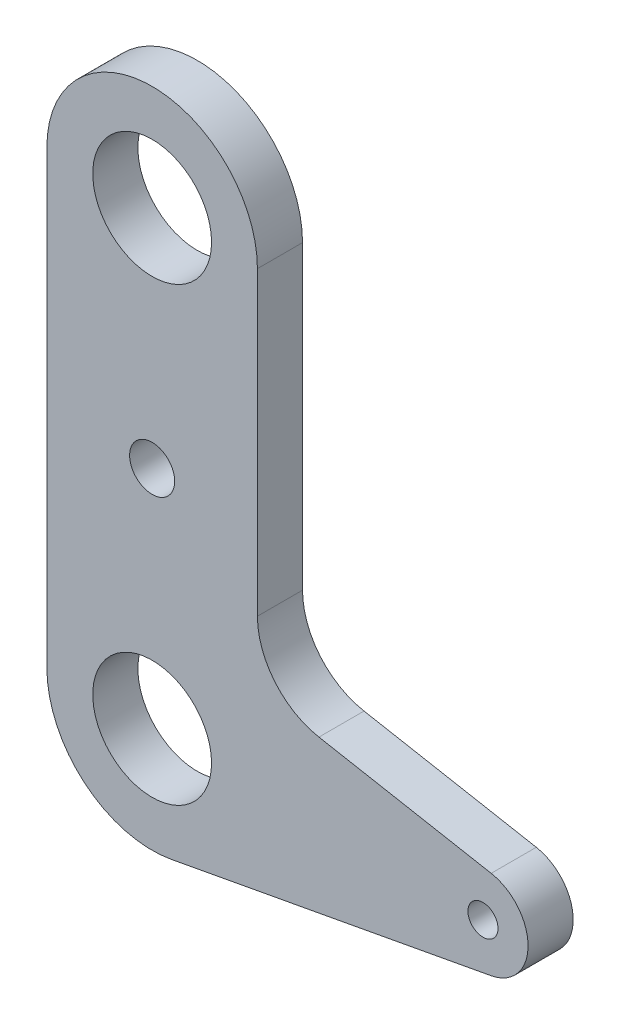
ISO-10303-21;
HEADER;
FILE_DESCRIPTION(('STEP AP214'),'2;1');
FILE_NAME('part.step','',(''),(''),'','','');
FILE_SCHEMA(('AUTOMOTIVE_DESIGN { 1 0 10303 214 1 1 1 1 }'));
ENDSEC;
DATA;
#1=APPLICATION_CONTEXT('core data for automotive mechanical design processes');
#2=APPLICATION_PROTOCOL_DEFINITION('international standard','automotive_design',2000,#1);
#3=PRODUCT_CONTEXT('',#1,'mechanical');
#4=PRODUCT('Part','Part','',(#3));
#5=PRODUCT_RELATED_PRODUCT_CATEGORY('part','',(#4));
#6=PRODUCT_DEFINITION_FORMATION('','',#4);
#7=PRODUCT_DEFINITION_CONTEXT('part definition',#1,'design');
#8=PRODUCT_DEFINITION('design','',#6,#7);
#9=PRODUCT_DEFINITION_SHAPE('','',#8);
#10=(LENGTH_UNIT() NAMED_UNIT(*) SI_UNIT(.MILLI.,.METRE.));
#11=(NAMED_UNIT(*) PLANE_ANGLE_UNIT() SI_UNIT($,.RADIAN.));
#12=(NAMED_UNIT(*) SI_UNIT($,.STERADIAN.) SOLID_ANGLE_UNIT());
#13=UNCERTAINTY_MEASURE_WITH_UNIT(LENGTH_MEASURE(1.E-05),#10,'distance_accuracy_value','');
#14=(GEOMETRIC_REPRESENTATION_CONTEXT(3) GLOBAL_UNCERTAINTY_ASSIGNED_CONTEXT((#13)) GLOBAL_UNIT_ASSIGNED_CONTEXT((#10,
#11,#12)) REPRESENTATION_CONTEXT('',''));
#15=CARTESIAN_POINT('',(0.,0.,0.));
#16=DIRECTION('',(0.,0.,1.));
#17=DIRECTION('',(1.,0.,0.));
#18=AXIS2_PLACEMENT_3D('',#15,#16,#17);
#19=CARTESIAN_POINT('',(-7.,0.,3.));
#20=DIRECTION('',(1.,0.,0.));
#21=DIRECTION('',(0.,1.,0.));
#22=AXIS2_PLACEMENT_3D('',#19,#20,#21);
#23=PLANE('',#22);
#24=DIRECTION('',(0.,-1.,0.));
#25=VECTOR('',#24,1.);
#26=CARTESIAN_POINT('',(-7.,0.,0.));
#27=LINE('',#26,#25);
#28=CARTESIAN_POINT('',(-7.,30.,0.));
#29=VERTEX_POINT('',#28);
#30=CARTESIAN_POINT('',(-7.,0.,0.));
#31=VERTEX_POINT('',#30);
#32=EDGE_CURVE('E129',#29,#31,#27,.T.);
#33=ORIENTED_EDGE('',*,*,#32,.T.);
#34=DIRECTION('',(0.,0.,-1.));
#35=VECTOR('',#34,1.);
#36=CARTESIAN_POINT('',(-7.,0.,3.));
#37=LINE('',#36,#35);
#38=CARTESIAN_POINT('',(-7.,0.,3.));
#39=VERTEX_POINT('',#38);
#40=EDGE_CURVE('E108',#39,#31,#37,.T.);
#41=ORIENTED_EDGE('',*,*,#40,.F.);
#42=DIRECTION('',(0.,-1.,0.));
#43=VECTOR('',#42,1.);
#44=CARTESIAN_POINT('',(-7.,0.,3.));
#45=LINE('',#44,#43);
#46=CARTESIAN_POINT('',(-7.,30.,3.));
#47=VERTEX_POINT('',#46);
#48=EDGE_CURVE('E115',#47,#39,#45,.T.);
#49=ORIENTED_EDGE('',*,*,#48,.F.);
#50=DIRECTION('',(0.,0.,-1.));
#51=VECTOR('',#50,1.);
#52=CARTESIAN_POINT('',(-7.,30.,3.));
#53=LINE('',#52,#51);
#54=EDGE_CURVE('E145',#47,#29,#53,.T.);
#55=ORIENTED_EDGE('',*,*,#54,.T.);
#56=EDGE_LOOP('',(#33,#41,#49,#55));
#57=FACE_BOUND('',#56,.T.);
#58=ADVANCED_FACE('F41',(#57),#23,.F.);
#59=CARTESIAN_POINT('',(0.,0.,3.));
#60=DIRECTION('',(0.,0.,-1.));
#61=DIRECTION('',(-1.,0.,0.));
#62=AXIS2_PLACEMENT_3D('',#59,#60,#61);
#63=CYLINDRICAL_SURFACE('',#62,7.);
#64=CARTESIAN_POINT('',(0.,0.,0.));
#65=DIRECTION('',(0.,0.,1.));
#66=DIRECTION('',(1.,0.,0.));
#67=AXIS2_PLACEMENT_3D('',#64,#65,#66);
#68=CIRCLE('',#67,7.);
#69=CARTESIAN_POINT('',(1.27272727272727,-6.88332516224943,0.));
#70=VERTEX_POINT('',#69);
#71=EDGE_CURVE('E168',#31,#70,#68,.T.);
#72=ORIENTED_EDGE('',*,*,#71,.T.);
#73=DIRECTION('',(0.,0.,-1.));
#74=VECTOR('',#73,1.);
#75=CARTESIAN_POINT('',(1.27272727272727,-6.88332516224943,3.));
#76=LINE('',#75,#74);
#77=CARTESIAN_POINT('',(1.27272727272727,-6.88332516224943,3.));
#78=VERTEX_POINT('',#77);
#79=EDGE_CURVE('E111',#78,#70,#76,.T.);
#80=ORIENTED_EDGE('',*,*,#79,.F.);
#81=CARTESIAN_POINT('',(0.,0.,3.));
#82=DIRECTION('',(0.,0.,1.));
#83=DIRECTION('',(1.,0.,0.));
#84=AXIS2_PLACEMENT_3D('',#81,#82,#83);
#85=CIRCLE('',#84,7.);
#86=EDGE_CURVE('E104',#39,#78,#85,.T.);
#87=ORIENTED_EDGE('',*,*,#86,.F.);
#88=ORIENTED_EDGE('',*,*,#40,.T.);
#89=EDGE_LOOP('',(#72,#80,#87,#88));
#90=FACE_BOUND('',#89,.T.);
#91=ADVANCED_FACE('F106',(#90),#63,.T.);
#92=CARTESIAN_POINT('',(1.27272727272727,-6.88332516224943,3.));
#93=DIRECTION('',(-0.181818181818182,0.983332166035633,0.));
#94=DIRECTION('',(-0.983332166035634,-0.181818181818182,0.));
#95=AXIS2_PLACEMENT_3D('',#92,#93,#94);
#96=PLANE('',#95);
#97=DIRECTION('',(0.983332166035634,0.181818181818182,0.));
#98=VECTOR('',#97,1.);
#99=CARTESIAN_POINT('',(1.27272727272727,-6.88332516224943,0.));
#100=LINE('',#99,#98);
#101=CARTESIAN_POINT('',(22.5454545454545,-2.9499964981069,0.));
#102=VERTEX_POINT('',#101);
#103=EDGE_CURVE('E166',#70,#102,#100,.T.);
#104=ORIENTED_EDGE('',*,*,#103,.T.);
#105=DIRECTION('',(0.,0.,-1.));
#106=VECTOR('',#105,1.);
#107=CARTESIAN_POINT('',(22.5454545454545,-2.9499964981069,3.));
#108=LINE('',#107,#106);
#109=CARTESIAN_POINT('',(22.5454545454545,-2.9499964981069,3.));
#110=VERTEX_POINT('',#109);
#111=EDGE_CURVE('E134',#110,#102,#108,.T.);
#112=ORIENTED_EDGE('',*,*,#111,.F.);
#113=DIRECTION('',(0.983332166035634,0.181818181818182,0.));
#114=VECTOR('',#113,1.);
#115=CARTESIAN_POINT('',(1.27272727272727,-6.88332516224943,3.));
#116=LINE('',#115,#114);
#117=EDGE_CURVE('E114',#78,#110,#116,.T.);
#118=ORIENTED_EDGE('',*,*,#117,.F.);
#119=ORIENTED_EDGE('',*,*,#79,.T.);
#120=EDGE_LOOP('',(#104,#112,#118,#119));
#121=FACE_BOUND('',#120,.T.);
#122=ADVANCED_FACE('F215',(#121),#96,.F.);
#123=CARTESIAN_POINT('',(22.,0.,3.));
#124=DIRECTION('',(0.,0.,-1.));
#125=DIRECTION('',(-1.,0.,0.));
#126=AXIS2_PLACEMENT_3D('',#123,#124,#125);
#127=CYLINDRICAL_SURFACE('',#126,3.);
#128=CARTESIAN_POINT('',(22.,0.,0.));
#129=DIRECTION('',(0.,0.,1.));
#130=DIRECTION('',(1.,0.,0.));
#131=AXIS2_PLACEMENT_3D('',#128,#129,#130);
#132=CIRCLE('',#131,3.);
#133=CARTESIAN_POINT('',(22.5454545454545,2.9499964981069,0.));
#134=VERTEX_POINT('',#133);
#135=EDGE_CURVE('E163',#102,#134,#132,.T.);
#136=ORIENTED_EDGE('',*,*,#135,.T.);
#137=DIRECTION('',(0.,0.,-1.));
#138=VECTOR('',#137,1.);
#139=CARTESIAN_POINT('',(22.5454545454545,2.9499964981069,3.));
#140=LINE('',#139,#138);
#141=CARTESIAN_POINT('',(22.5454545454545,2.9499964981069,3.));
#142=VERTEX_POINT('',#141);
#143=EDGE_CURVE('E140',#142,#134,#140,.T.);
#144=ORIENTED_EDGE('',*,*,#143,.F.);
#145=CARTESIAN_POINT('',(22.,0.,3.));
#146=DIRECTION('',(0.,0.,1.));
#147=DIRECTION('',(1.,0.,0.));
#148=AXIS2_PLACEMENT_3D('',#145,#146,#147);
#149=CIRCLE('',#148,3.);
#150=EDGE_CURVE('E188',#110,#142,#149,.T.);
#151=ORIENTED_EDGE('',*,*,#150,.F.);
#152=ORIENTED_EDGE('',*,*,#111,.T.);
#153=EDGE_LOOP('',(#136,#144,#151,#152));
#154=FACE_BOUND('',#153,.T.);
#155=ADVANCED_FACE('F241',(#154),#127,.T.);
#156=CARTESIAN_POINT('',(1.27272727272727,6.88332516224943,3.));
#157=DIRECTION('',(0.181818181818182,0.983332166035633,0.));
#158=DIRECTION('',(-0.983332166035634,0.181818181818182,0.));
#159=AXIS2_PLACEMENT_3D('',#156,#157,#158);
#160=PLANE('',#159);
#161=DIRECTION('',(0.983332166035634,-0.181818181818182,0.));
#162=VECTOR('',#161,1.);
#163=CARTESIAN_POINT('',(1.27272727272727,6.88332516224943,0.));
#164=LINE('',#163,#162);
#165=CARTESIAN_POINT('',(11.0909090909091,5.06794270187596,0.));
#166=VERTEX_POINT('',#165);
#167=EDGE_CURVE('E161',#166,#134,#164,.T.);
#168=ORIENTED_EDGE('',*,*,#167,.F.);
#169=DIRECTION('',(0.,0.,-1.));
#170=VECTOR('',#169,1.);
#171=CARTESIAN_POINT('',(11.0909090909091,5.06794270187596,3.));
#172=LINE('',#171,#170);
#173=CARTESIAN_POINT('',(11.0909090909091,5.06794270187596,3.));
#174=VERTEX_POINT('',#173);
#175=EDGE_CURVE('E56',#166,#174,#172,.F.);
#176=ORIENTED_EDGE('',*,*,#175,.T.);
#177=DIRECTION('',(0.983332166035634,-0.181818181818182,0.));
#178=VECTOR('',#177,1.);
#179=CARTESIAN_POINT('',(1.27272727272727,6.88332516224943,3.));
#180=LINE('',#179,#178);
#181=EDGE_CURVE('E186',#174,#142,#180,.T.);
#182=ORIENTED_EDGE('',*,*,#181,.T.);
#183=ORIENTED_EDGE('',*,*,#143,.T.);
#184=EDGE_LOOP('',(#168,#176,#182,#183));
#185=FACE_BOUND('',#184,.T.);
#186=ADVANCED_FACE('F237',(#185),#160,.T.);
#187=CARTESIAN_POINT('',(7.,0.,3.));
#188=DIRECTION('',(1.,0.,0.));
#189=DIRECTION('',(0.,1.,0.));
#190=AXIS2_PLACEMENT_3D('',#187,#188,#189);
#191=PLANE('',#190);
#192=DIRECTION('',(0.,-1.,0.));
#193=VECTOR('',#192,1.);
#194=CARTESIAN_POINT('',(7.,0.,3.));
#195=LINE('',#194,#193);
#196=CARTESIAN_POINT('',(7.,30.,3.));
#197=VERTEX_POINT('',#196);
#198=CARTESIAN_POINT('',(7.,9.98460353205412,3.));
#199=VERTEX_POINT('',#198);
#200=EDGE_CURVE('E183',#197,#199,#195,.T.);
#201=ORIENTED_EDGE('',*,*,#200,.T.);
#202=DIRECTION('',(0.,0.,-1.));
#203=VECTOR('',#202,1.);
#204=CARTESIAN_POINT('',(7.,9.98460353205412,0.));
#205=LINE('',#204,#203);
#206=CARTESIAN_POINT('',(7.,9.98460353205412,0.));
#207=VERTEX_POINT('',#206);
#208=EDGE_CURVE('E130',#199,#207,#205,.T.);
#209=ORIENTED_EDGE('',*,*,#208,.T.);
#210=DIRECTION('',(0.,-1.,0.));
#211=VECTOR('',#210,1.);
#212=CARTESIAN_POINT('',(7.,0.,0.));
#213=LINE('',#212,#211);
#214=CARTESIAN_POINT('',(7.,30.,0.));
#215=VERTEX_POINT('',#214);
#216=EDGE_CURVE('E159',#215,#207,#213,.T.);
#217=ORIENTED_EDGE('',*,*,#216,.F.);
#218=DIRECTION('',(0.,0.,-1.));
#219=VECTOR('',#218,1.);
#220=CARTESIAN_POINT('',(7.,30.,3.));
#221=LINE('',#220,#219);
#222=EDGE_CURVE('E143',#197,#215,#221,.T.);
#223=ORIENTED_EDGE('',*,*,#222,.F.);
#224=EDGE_LOOP('',(#201,#209,#217,#223));
#225=FACE_BOUND('',#224,.T.);
#226=ADVANCED_FACE('F234',(#225),#191,.T.);
#227=CARTESIAN_POINT('',(0.,0.,3.));
#228=DIRECTION('',(0.,0.,-1.));
#229=DIRECTION('',(-1.,0.,0.));
#230=AXIS2_PLACEMENT_3D('',#227,#228,#229);
#231=CYLINDRICAL_SURFACE('',#230,3.95);
#232=CARTESIAN_POINT('',(0.,0.,3.));
#233=DIRECTION('',(0.,0.,1.));
#234=DIRECTION('',(1.,0.,0.));
#235=AXIS2_PLACEMENT_3D('',#232,#233,#234);
#236=CIRCLE('',#235,3.95);
#237=CARTESIAN_POINT('',(3.95,0.,3.));
#238=VERTEX_POINT('',#237);
#239=EDGE_CURVE('E176',#238,#238,#236,.T.);
#240=ORIENTED_EDGE('',*,*,#239,.T.);
#241=EDGE_LOOP('',(#240));
#242=FACE_BOUND('',#241,.T.);
#243=CARTESIAN_POINT('',(0.,0.,0.));
#244=DIRECTION('',(0.,0.,1.));
#245=DIRECTION('',(1.,0.,0.));
#246=AXIS2_PLACEMENT_3D('',#243,#244,#245);
#247=CIRCLE('',#246,3.95);
#248=CARTESIAN_POINT('',(3.95,0.,0.));
#249=VERTEX_POINT('',#248);
#250=EDGE_CURVE('E151',#249,#249,#247,.T.);
#251=ORIENTED_EDGE('',*,*,#250,.F.);
#252=EDGE_LOOP('',(#251));
#253=FACE_BOUND('',#252,.T.);
#254=ADVANCED_FACE('F229',(#242,#253),#231,.F.);
#255=CARTESIAN_POINT('',(0.,30.,3.));
#256=DIRECTION('',(0.,0.,-1.));
#257=DIRECTION('',(-1.,0.,0.));
#258=AXIS2_PLACEMENT_3D('',#255,#256,#257);
#259=CYLINDRICAL_SURFACE('',#258,3.95);
#260=CARTESIAN_POINT('',(0.,30.,3.));
#261=DIRECTION('',(0.,0.,1.));
#262=DIRECTION('',(1.,0.,0.));
#263=AXIS2_PLACEMENT_3D('',#260,#261,#262);
#264=CIRCLE('',#263,3.95);
#265=CARTESIAN_POINT('',(3.95,30.,3.));
#266=VERTEX_POINT('',#265);
#267=EDGE_CURVE('E179',#266,#266,#264,.T.);
#268=ORIENTED_EDGE('',*,*,#267,.T.);
#269=EDGE_LOOP('',(#268));
#270=FACE_BOUND('',#269,.T.);
#271=CARTESIAN_POINT('',(0.,30.,0.));
#272=DIRECTION('',(0.,0.,1.));
#273=DIRECTION('',(1.,0.,0.));
#274=AXIS2_PLACEMENT_3D('',#271,#272,#273);
#275=CIRCLE('',#274,3.95);
#276=CARTESIAN_POINT('',(3.95,30.,0.));
#277=VERTEX_POINT('',#276);
#278=EDGE_CURVE('E154',#277,#277,#275,.T.);
#279=ORIENTED_EDGE('',*,*,#278,.F.);
#280=EDGE_LOOP('',(#279));
#281=FACE_BOUND('',#280,.T.);
#282=ADVANCED_FACE('F223',(#270,#281),#259,.F.);
#283=CARTESIAN_POINT('',(0.,30.,3.));
#284=DIRECTION('',(0.,0.,-1.));
#285=DIRECTION('',(-1.,0.,0.));
#286=AXIS2_PLACEMENT_3D('',#283,#284,#285);
#287=CYLINDRICAL_SURFACE('',#286,7.);
#288=CARTESIAN_POINT('',(0.,30.,0.));
#289=DIRECTION('',(0.,0.,1.));
#290=DIRECTION('',(1.,0.,0.));
#291=AXIS2_PLACEMENT_3D('',#288,#289,#290);
#292=CIRCLE('',#291,7.);
#293=EDGE_CURVE('E157',#215,#29,#292,.T.);
#294=ORIENTED_EDGE('',*,*,#293,.T.);
#295=ORIENTED_EDGE('',*,*,#54,.F.);
#296=CARTESIAN_POINT('',(0.,30.,3.));
#297=DIRECTION('',(0.,0.,1.));
#298=DIRECTION('',(1.,0.,0.));
#299=AXIS2_PLACEMENT_3D('',#296,#297,#298);
#300=CIRCLE('',#299,7.);
#301=EDGE_CURVE('E122',#197,#47,#300,.T.);
#302=ORIENTED_EDGE('',*,*,#301,.F.);
#303=ORIENTED_EDGE('',*,*,#222,.T.);
#304=EDGE_LOOP('',(#294,#295,#302,#303));
#305=FACE_BOUND('',#304,.T.);
#306=ADVANCED_FACE('F219',(#305),#287,.T.);
#307=CARTESIAN_POINT('',(0.,15.,3.));
#308=DIRECTION('',(0.,0.,-1.));
#309=DIRECTION('',(-1.,0.,0.));
#310=AXIS2_PLACEMENT_3D('',#307,#308,#309);
#311=CYLINDRICAL_SURFACE('',#310,1.5);
#312=CARTESIAN_POINT('',(0.,15.,3.));
#313=DIRECTION('',(0.,0.,1.));
#314=DIRECTION('',(1.,0.,0.));
#315=AXIS2_PLACEMENT_3D('',#312,#313,#314);
#316=CIRCLE('',#315,1.5);
#317=CARTESIAN_POINT('',(1.5,15.,3.));
#318=VERTEX_POINT('',#317);
#319=EDGE_CURVE('E126',#318,#318,#316,.T.);
#320=ORIENTED_EDGE('',*,*,#319,.T.);
#321=EDGE_LOOP('',(#320));
#322=FACE_BOUND('',#321,.T.);
#323=CARTESIAN_POINT('',(0.,15.,0.));
#324=DIRECTION('',(0.,0.,1.));
#325=DIRECTION('',(1.,0.,0.));
#326=AXIS2_PLACEMENT_3D('',#323,#324,#325);
#327=CIRCLE('',#326,1.5);
#328=CARTESIAN_POINT('',(1.5,15.,0.));
#329=VERTEX_POINT('',#328);
#330=EDGE_CURVE('E171',#329,#329,#327,.T.);
#331=ORIENTED_EDGE('',*,*,#330,.F.);
#332=EDGE_LOOP('',(#331));
#333=FACE_BOUND('',#332,.T.);
#334=ADVANCED_FACE('F195',(#322,#333),#311,.F.);
#335=CARTESIAN_POINT('',(22.,0.,3.));
#336=DIRECTION('',(0.,0.,-1.));
#337=DIRECTION('',(-1.,0.,0.));
#338=AXIS2_PLACEMENT_3D('',#335,#336,#337);
#339=CYLINDRICAL_SURFACE('',#338,1.);
#340=CARTESIAN_POINT('',(22.,0.,3.));
#341=DIRECTION('',(0.,0.,1.));
#342=DIRECTION('',(1.,0.,0.));
#343=AXIS2_PLACEMENT_3D('',#340,#341,#342);
#344=CIRCLE('',#343,1.);
#345=CARTESIAN_POINT('',(23.,0.,3.));
#346=VERTEX_POINT('',#345);
#347=EDGE_CURVE('E147',#346,#346,#344,.T.);
#348=ORIENTED_EDGE('',*,*,#347,.T.);
#349=EDGE_LOOP('',(#348));
#350=FACE_BOUND('',#349,.T.);
#351=CARTESIAN_POINT('',(22.,0.,0.));
#352=DIRECTION('',(0.,0.,1.));
#353=DIRECTION('',(1.,0.,0.));
#354=AXIS2_PLACEMENT_3D('',#351,#352,#353);
#355=CIRCLE('',#354,1.);
#356=CARTESIAN_POINT('',(23.,0.,0.));
#357=VERTEX_POINT('',#356);
#358=EDGE_CURVE('E148',#357,#357,#355,.T.);
#359=ORIENTED_EDGE('',*,*,#358,.F.);
#360=EDGE_LOOP('',(#359));
#361=FACE_BOUND('',#360,.T.);
#362=ADVANCED_FACE('F200',(#350,#361),#339,.F.);
#363=CARTESIAN_POINT('',(0.,0.,3.));
#364=DIRECTION('',(0.,0.,1.));
#365=DIRECTION('',(1.,0.,0.));
#366=AXIS2_PLACEMENT_3D('',#363,#364,#365);
#367=PLANE('',#366);
#368=ORIENTED_EDGE('',*,*,#319,.F.);
#369=EDGE_LOOP('',(#368));
#370=FACE_BOUND('',#369,.T.);
#371=ORIENTED_EDGE('',*,*,#48,.T.);
#372=ORIENTED_EDGE('',*,*,#86,.T.);
#373=ORIENTED_EDGE('',*,*,#117,.T.);
#374=ORIENTED_EDGE('',*,*,#150,.T.);
#375=ORIENTED_EDGE('',*,*,#181,.F.);
#376=CARTESIAN_POINT('',(12.,9.98460353205412,3.));
#377=DIRECTION('',(0.,0.,1.));
#378=DIRECTION('',(1.,0.,0.));
#379=AXIS2_PLACEMENT_3D('',#376,#377,#378);
#380=CIRCLE('',#379,5.);
#381=EDGE_CURVE('E11',#174,#199,#380,.F.);
#382=ORIENTED_EDGE('',*,*,#381,.T.);
#383=ORIENTED_EDGE('',*,*,#200,.F.);
#384=ORIENTED_EDGE('',*,*,#301,.T.);
#385=EDGE_LOOP('',(#371,#372,#373,#374,#375,#382,#383,#384));
#386=FACE_BOUND('',#385,.T.);
#387=ORIENTED_EDGE('',*,*,#267,.F.);
#388=EDGE_LOOP('',(#387));
#389=FACE_BOUND('',#388,.T.);
#390=ORIENTED_EDGE('',*,*,#239,.F.);
#391=EDGE_LOOP('',(#390));
#392=FACE_BOUND('',#391,.T.);
#393=ORIENTED_EDGE('',*,*,#347,.F.);
#394=EDGE_LOOP('',(#393));
#395=FACE_BOUND('',#394,.T.);
#396=ADVANCED_FACE('F118',(#370,#386,#389,#392,#395),#367,.T.);
#397=CARTESIAN_POINT('',(0.,0.,0.));
#398=DIRECTION('',(0.,0.,1.));
#399=DIRECTION('',(1.,0.,0.));
#400=AXIS2_PLACEMENT_3D('',#397,#398,#399);
#401=PLANE('',#400);
#402=ORIENTED_EDGE('',*,*,#330,.T.);
#403=EDGE_LOOP('',(#402));
#404=FACE_BOUND('',#403,.T.);
#405=ORIENTED_EDGE('',*,*,#32,.F.);
#406=ORIENTED_EDGE('',*,*,#293,.F.);
#407=ORIENTED_EDGE('',*,*,#216,.T.);
#408=CARTESIAN_POINT('',(12.,9.98460353205412,0.));
#409=DIRECTION('',(0.,0.,1.));
#410=DIRECTION('',(1.,0.,0.));
#411=AXIS2_PLACEMENT_3D('',#408,#409,#410);
#412=CIRCLE('',#411,5.);
#413=EDGE_CURVE('E49',#207,#166,#412,.T.);
#414=ORIENTED_EDGE('',*,*,#413,.T.);
#415=ORIENTED_EDGE('',*,*,#167,.T.);
#416=ORIENTED_EDGE('',*,*,#135,.F.);
#417=ORIENTED_EDGE('',*,*,#103,.F.);
#418=ORIENTED_EDGE('',*,*,#71,.F.);
#419=EDGE_LOOP('',(#405,#406,#407,#414,#415,#416,#417,#418));
#420=FACE_BOUND('',#419,.T.);
#421=ORIENTED_EDGE('',*,*,#278,.T.);
#422=EDGE_LOOP('',(#421));
#423=FACE_BOUND('',#422,.T.);
#424=ORIENTED_EDGE('',*,*,#250,.T.);
#425=EDGE_LOOP('',(#424));
#426=FACE_BOUND('',#425,.T.);
#427=ORIENTED_EDGE('',*,*,#358,.T.);
#428=EDGE_LOOP('',(#427));
#429=FACE_BOUND('',#428,.T.);
#430=ADVANCED_FACE('F199',(#404,#420,#423,#426,#429),#401,.F.);
#431=CARTESIAN_POINT('',(12.,9.98460353205412,3.));
#432=DIRECTION('',(0.,0.,1.));
#433=DIRECTION('',(1.,0.,0.));
#434=AXIS2_PLACEMENT_3D('',#431,#432,#433);
#435=CYLINDRICAL_SURFACE('',#434,5.);
#436=ORIENTED_EDGE('',*,*,#381,.F.);
#437=ORIENTED_EDGE('',*,*,#175,.F.);
#438=ORIENTED_EDGE('',*,*,#413,.F.);
#439=ORIENTED_EDGE('',*,*,#208,.F.);
#440=EDGE_LOOP('',(#436,#437,#438,#439));
#441=FACE_BOUND('',#440,.T.);
#442=ADVANCED_FACE('F43',(#441),#435,.F.);
#443=CLOSED_SHELL('',(#58,#91,#122,#155,#186,#226,#254,#282,#306,#334,#362,#396,#430,#442));
#444=MANIFOLD_SOLID_BREP('B2',#443);
#445=ADVANCED_BREP_SHAPE_REPRESENTATION('',(#18,#444),#14);
#446=SHAPE_DEFINITION_REPRESENTATION(#9,#445);
ENDSEC;
END-ISO-10303-21;
